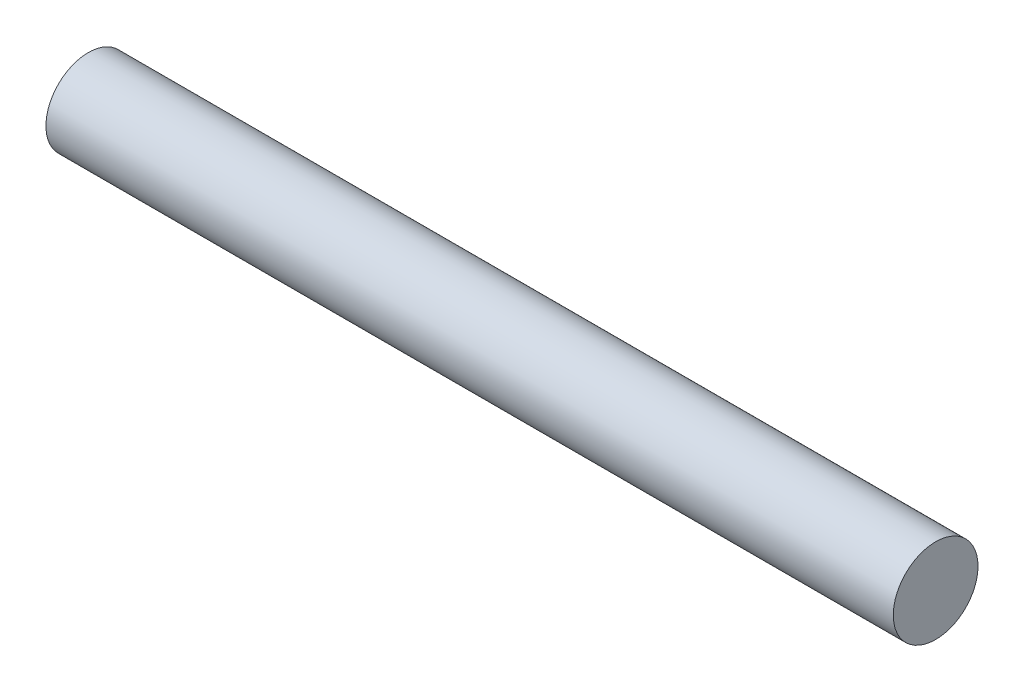
ISO-10303-21;
HEADER;
FILE_DESCRIPTION(('STEP AP214'),'2;1');
FILE_NAME('part.step','',(''),(''),'','','');
FILE_SCHEMA(('AUTOMOTIVE_DESIGN { 1 0 10303 214 1 1 1 1 }'));
ENDSEC;
DATA;
#1=APPLICATION_CONTEXT('core data for automotive mechanical design processes');
#2=APPLICATION_PROTOCOL_DEFINITION('international standard','automotive_design',2000,#1);
#3=PRODUCT_CONTEXT('',#1,'mechanical');
#4=PRODUCT('Part','Part','',(#3));
#5=PRODUCT_RELATED_PRODUCT_CATEGORY('part','',(#4));
#6=PRODUCT_DEFINITION_FORMATION('','',#4);
#7=PRODUCT_DEFINITION_CONTEXT('part definition',#1,'design');
#8=PRODUCT_DEFINITION('design','',#6,#7);
#9=PRODUCT_DEFINITION_SHAPE('','',#8);
#10=(LENGTH_UNIT() NAMED_UNIT(*) SI_UNIT(.MILLI.,.METRE.));
#11=(NAMED_UNIT(*) PLANE_ANGLE_UNIT() SI_UNIT($,.RADIAN.));
#12=(NAMED_UNIT(*) SI_UNIT($,.STERADIAN.) SOLID_ANGLE_UNIT());
#13=UNCERTAINTY_MEASURE_WITH_UNIT(LENGTH_MEASURE(1.E-05),#10,'distance_accuracy_value','');
#14=(GEOMETRIC_REPRESENTATION_CONTEXT(3) GLOBAL_UNCERTAINTY_ASSIGNED_CONTEXT((#13)) GLOBAL_UNIT_ASSIGNED_CONTEXT((#10,
#11,#12)) REPRESENTATION_CONTEXT('',''));
#15=CARTESIAN_POINT('',(0.,0.,0.));
#16=DIRECTION('',(0.,0.,1.));
#17=DIRECTION('',(1.,0.,0.));
#18=AXIS2_PLACEMENT_3D('',#15,#16,#17);
#19=CARTESIAN_POINT('',(25.,0.,0.));
#20=DIRECTION('',(-1.,0.,0.));
#21=DIRECTION('',(0.,0.,1.));
#22=AXIS2_PLACEMENT_3D('',#19,#20,#21);
#23=CYLINDRICAL_SURFACE('',#22,2.5);
#24=CARTESIAN_POINT('',(25.,0.,0.));
#25=DIRECTION('',(1.,0.,0.));
#26=DIRECTION('',(0.,0.,-1.));
#27=AXIS2_PLACEMENT_3D('',#24,#25,#26);
#28=CIRCLE('',#27,2.5);
#29=CARTESIAN_POINT('',(25.,0.,-2.5));
#30=VERTEX_POINT('',#29);
#31=EDGE_CURVE('E10',#30,#30,#28,.T.);
#32=ORIENTED_EDGE('',*,*,#31,.F.);
#33=EDGE_LOOP('',(#32));
#34=FACE_BOUND('',#33,.T.);
#35=CARTESIAN_POINT('',(-25.,0.,0.));
#36=DIRECTION('',(1.,0.,0.));
#37=DIRECTION('',(0.,0.,-1.));
#38=AXIS2_PLACEMENT_3D('',#35,#36,#37);
#39=CIRCLE('',#38,2.5);
#40=CARTESIAN_POINT('',(-25.,0.,-2.5));
#41=VERTEX_POINT('',#40);
#42=EDGE_CURVE('E40',#41,#41,#39,.T.);
#43=ORIENTED_EDGE('',*,*,#42,.T.);
#44=EDGE_LOOP('',(#43));
#45=FACE_BOUND('',#44,.T.);
#46=ADVANCED_FACE('F37',(#34,#45),#23,.T.);
#47=CARTESIAN_POINT('',(25.,0.,0.));
#48=DIRECTION('',(1.,0.,0.));
#49=DIRECTION('',(0.,0.,-1.));
#50=AXIS2_PLACEMENT_3D('',#47,#48,#49);
#51=PLANE('',#50);
#52=ORIENTED_EDGE('',*,*,#31,.T.);
#53=EDGE_LOOP('',(#52));
#54=FACE_BOUND('',#53,.T.);
#55=ADVANCED_FACE('F52',(#54),#51,.T.);
#56=CARTESIAN_POINT('',(-25.,0.,0.));
#57=DIRECTION('',(1.,0.,0.));
#58=DIRECTION('',(0.,0.,-1.));
#59=AXIS2_PLACEMENT_3D('',#56,#57,#58);
#60=PLANE('',#59);
#61=ORIENTED_EDGE('',*,*,#42,.F.);
#62=EDGE_LOOP('',(#61));
#63=FACE_BOUND('',#62,.T.);
#64=ADVANCED_FACE('F50',(#63),#60,.F.);
#65=CLOSED_SHELL('',(#46,#55,#64));
#66=MANIFOLD_SOLID_BREP('B2',#65);
#67=ADVANCED_BREP_SHAPE_REPRESENTATION('',(#18,#66),#14);
#68=SHAPE_DEFINITION_REPRESENTATION(#9,#67);
ENDSEC;
END-ISO-10303-21;
